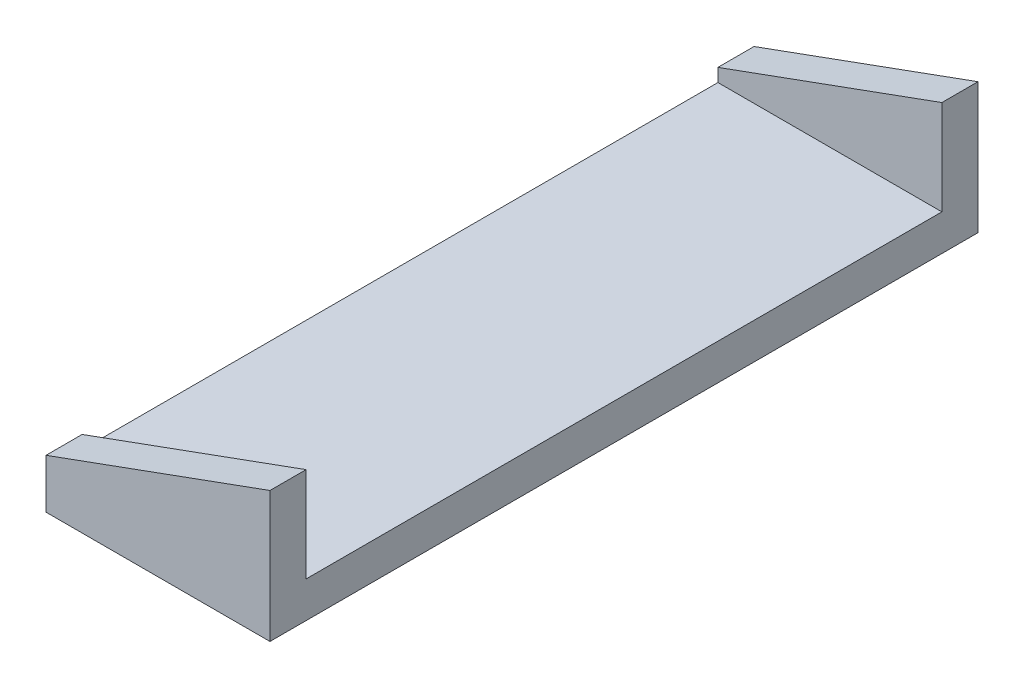
ISO-10303-21;
HEADER;
FILE_DESCRIPTION(('STEP AP214'),'2;1');
FILE_NAME('part.step','',(''),(''),'','','');
FILE_SCHEMA(('AUTOMOTIVE_DESIGN { 1 0 10303 214 1 1 1 1 }'));
ENDSEC;
DATA;
#1=APPLICATION_CONTEXT('core data for automotive mechanical design processes');
#2=APPLICATION_PROTOCOL_DEFINITION('international standard','automotive_design',2000,#1);
#3=PRODUCT_CONTEXT('',#1,'mechanical');
#4=PRODUCT('Part','Part','',(#3));
#5=PRODUCT_RELATED_PRODUCT_CATEGORY('part','',(#4));
#6=PRODUCT_DEFINITION_FORMATION('','',#4);
#7=PRODUCT_DEFINITION_CONTEXT('part definition',#1,'design');
#8=PRODUCT_DEFINITION('design','',#6,#7);
#9=PRODUCT_DEFINITION_SHAPE('','',#8);
#10=(LENGTH_UNIT() NAMED_UNIT(*) SI_UNIT(.MILLI.,.METRE.));
#11=(NAMED_UNIT(*) PLANE_ANGLE_UNIT() SI_UNIT($,.RADIAN.));
#12=(NAMED_UNIT(*) SI_UNIT($,.STERADIAN.) SOLID_ANGLE_UNIT());
#13=UNCERTAINTY_MEASURE_WITH_UNIT(LENGTH_MEASURE(1.E-05),#10,'distance_accuracy_value','');
#14=(GEOMETRIC_REPRESENTATION_CONTEXT(3) GLOBAL_UNCERTAINTY_ASSIGNED_CONTEXT((#13)) GLOBAL_UNIT_ASSIGNED_CONTEXT((#10,
#11,#12)) REPRESENTATION_CONTEXT('',''));
#15=CARTESIAN_POINT('',(0.,0.,0.));
#16=DIRECTION('',(0.,0.,1.));
#17=DIRECTION('',(1.,0.,0.));
#18=AXIS2_PLACEMENT_3D('',#15,#16,#17);
#19=CARTESIAN_POINT('',(0.,63.5,0.));
#20=DIRECTION('',(0.,0.,-1.));
#21=DIRECTION('',(-1.,0.,0.));
#22=AXIS2_PLACEMENT_3D('',#19,#20,#21);
#23=PLANE('',#22);
#24=DIRECTION('',(0.939692620785908,0.34202014332567,0.));
#25=VECTOR('',#24,1.);
#26=CARTESIAN_POINT('',(0.,63.5,0.));
#27=LINE('',#26,#25);
#28=CARTESIAN_POINT('',(63.5,86.6121098759039,0.));
#29=VERTEX_POINT('',#28);
#30=CARTESIAN_POINT('',(457.2,229.907191106508,0.));
#31=VERTEX_POINT('',#30);
#32=EDGE_CURVE('E134',#29,#31,#27,.T.);
#33=ORIENTED_EDGE('',*,*,#32,.F.);
#34=DIRECTION('',(0.,-1.,0.));
#35=VECTOR('',#34,1.);
#36=CARTESIAN_POINT('',(63.5,253.746,0.));
#37=LINE('',#36,#35);
#38=CARTESIAN_POINT('',(63.5,0.,0.));
#39=VERTEX_POINT('',#38);
#40=EDGE_CURVE('E46',#29,#39,#37,.T.);
#41=ORIENTED_EDGE('',*,*,#40,.T.);
#42=DIRECTION('',(1.,0.,0.));
#43=VECTOR('',#42,1.);
#44=CARTESIAN_POINT('',(0.,0.,0.));
#45=LINE('',#44,#43);
#46=CARTESIAN_POINT('',(457.2,0.,0.));
#47=VERTEX_POINT('',#46);
#48=EDGE_CURVE('E111',#39,#47,#45,.T.);
#49=ORIENTED_EDGE('',*,*,#48,.T.);
#50=DIRECTION('',(0.,-1.,0.));
#51=VECTOR('',#50,1.);
#52=CARTESIAN_POINT('',(457.2,63.5,0.));
#53=LINE('',#52,#51);
#54=EDGE_CURVE('E40',#31,#47,#53,.T.);
#55=ORIENTED_EDGE('',*,*,#54,.F.);
#56=EDGE_LOOP('',(#33,#41,#49,#55));
#57=FACE_BOUND('',#56,.T.);
#58=ADVANCED_FACE('F33',(#57),#23,.F.);
#59=CARTESIAN_POINT('',(457.2,63.5,0.));
#60=DIRECTION('',(-1.,0.,0.));
#61=DIRECTION('',(0.,0.,1.));
#62=AXIS2_PLACEMENT_3D('',#59,#60,#61);
#63=PLANE('',#62);
#64=DIRECTION('',(0.,0.,-1.));
#65=VECTOR('',#64,1.);
#66=CARTESIAN_POINT('',(457.2,229.907191106508,36.5759999999998));
#67=LINE('',#66,#65);
#68=CARTESIAN_POINT('',(457.2,229.907191106508,-63.5000000000001));
#69=VERTEX_POINT('',#68);
#70=EDGE_CURVE('E131',#31,#69,#67,.T.);
#71=ORIENTED_EDGE('',*,*,#70,.F.);
#72=ORIENTED_EDGE('',*,*,#54,.T.);
#73=DIRECTION('',(0.,0.,-1.));
#74=VECTOR('',#73,1.);
#75=CARTESIAN_POINT('',(457.2,0.,0.));
#76=LINE('',#75,#74);
#77=CARTESIAN_POINT('',(457.2,0.,-1244.6));
#78=VERTEX_POINT('',#77);
#79=EDGE_CURVE('E118',#47,#78,#76,.T.);
#80=ORIENTED_EDGE('',*,*,#79,.T.);
#81=DIRECTION('',(0.,-1.,0.));
#82=VECTOR('',#81,1.);
#83=CARTESIAN_POINT('',(457.2,63.5,-1244.6));
#84=LINE('',#83,#82);
#85=CARTESIAN_POINT('',(457.2,229.907191106508,-1244.6));
#86=VERTEX_POINT('',#85);
#87=EDGE_CURVE('E115',#86,#78,#84,.T.);
#88=ORIENTED_EDGE('',*,*,#87,.F.);
#89=DIRECTION('',(0.,0.,1.));
#90=VECTOR('',#89,1.);
#91=CARTESIAN_POINT('',(457.2,229.907191106508,-1281.176));
#92=LINE('',#91,#90);
#93=CARTESIAN_POINT('',(457.2,229.907191106508,-1181.1));
#94=VERTEX_POINT('',#93);
#95=EDGE_CURVE('E148',#86,#94,#92,.T.);
#96=ORIENTED_EDGE('',*,*,#95,.T.);
#97=DIRECTION('',(0.,-1.,0.));
#98=VECTOR('',#97,1.);
#99=CARTESIAN_POINT('',(457.2,330.2,-1181.1));
#100=LINE('',#99,#98);
#101=CARTESIAN_POINT('',(457.2,63.5,-1181.1));
#102=VERTEX_POINT('',#101);
#103=EDGE_CURVE('E135',#94,#102,#100,.T.);
#104=ORIENTED_EDGE('',*,*,#103,.T.);
#105=DIRECTION('',(0.,0.,-1.));
#106=VECTOR('',#105,1.);
#107=CARTESIAN_POINT('',(457.2,63.5,0.));
#108=LINE('',#107,#106);
#109=CARTESIAN_POINT('',(457.2,63.5,-63.5000000000001));
#110=VERTEX_POINT('',#109);
#111=EDGE_CURVE('E117',#110,#102,#108,.T.);
#112=ORIENTED_EDGE('',*,*,#111,.F.);
#113=DIRECTION('',(0.,-1.,0.));
#114=VECTOR('',#113,1.);
#115=CARTESIAN_POINT('',(457.2,330.2,-63.5000000000001));
#116=LINE('',#115,#114);
#117=EDGE_CURVE('E141',#69,#110,#116,.T.);
#118=ORIENTED_EDGE('',*,*,#117,.F.);
#119=EDGE_LOOP('',(#71,#72,#80,#88,#96,#104,#112,#118));
#120=FACE_BOUND('',#119,.T.);
#121=ADVANCED_FACE('F129',(#120),#63,.F.);
#122=CARTESIAN_POINT('',(457.2,330.2,-63.5000000000001));
#123=DIRECTION('',(0.,0.,1.));
#124=DIRECTION('',(1.,0.,0.));
#125=AXIS2_PLACEMENT_3D('',#122,#123,#124);
#126=PLANE('',#125);
#127=DIRECTION('',(-1.,0.,0.));
#128=VECTOR('',#127,1.);
#129=CARTESIAN_POINT('',(457.2,63.5,-63.5000000000001));
#130=LINE('',#129,#128);
#131=CARTESIAN_POINT('',(63.5,63.5,-63.5000000000001));
#132=VERTEX_POINT('',#131);
#133=EDGE_CURVE('E143',#110,#132,#130,.T.);
#134=ORIENTED_EDGE('',*,*,#133,.T.);
#135=DIRECTION('',(0.,1.,0.));
#136=VECTOR('',#135,1.);
#137=CARTESIAN_POINT('',(63.5,330.2,-63.5000000000001));
#138=LINE('',#137,#136);
#139=CARTESIAN_POINT('',(63.5,86.6121098759039,-63.5000000000001));
#140=VERTEX_POINT('',#139);
#141=EDGE_CURVE('E162',#132,#140,#138,.T.);
#142=ORIENTED_EDGE('',*,*,#141,.T.);
#143=DIRECTION('',(0.939692620785908,0.34202014332567,0.));
#144=VECTOR('',#143,1.);
#145=CARTESIAN_POINT('',(457.2,229.907191106508,-63.5000000000001));
#146=LINE('',#145,#144);
#147=EDGE_CURVE('E54',#140,#69,#146,.T.);
#148=ORIENTED_EDGE('',*,*,#147,.T.);
#149=ORIENTED_EDGE('',*,*,#117,.T.);
#150=EDGE_LOOP('',(#134,#142,#148,#149));
#151=FACE_BOUND('',#150,.T.);
#152=ADVANCED_FACE('F164',(#151),#126,.F.);
#153=CARTESIAN_POINT('',(0.,63.5,0.));
#154=DIRECTION('',(0.,-1.,0.));
#155=DIRECTION('',(0.,0.,-1.));
#156=AXIS2_PLACEMENT_3D('',#153,#154,#155);
#157=PLANE('',#156);
#158=DIRECTION('',(-1.,0.,0.));
#159=VECTOR('',#158,1.);
#160=CARTESIAN_POINT('',(457.2,63.5,-1181.1));
#161=LINE('',#160,#159);
#162=CARTESIAN_POINT('',(63.5000000000001,63.5,-1181.1));
#163=VERTEX_POINT('',#162);
#164=EDGE_CURVE('E136',#102,#163,#161,.T.);
#165=ORIENTED_EDGE('',*,*,#164,.T.);
#166=DIRECTION('',(0.,0.,1.));
#167=VECTOR('',#166,1.);
#168=CARTESIAN_POINT('',(63.5,63.5,0.));
#169=LINE('',#168,#167);
#170=EDGE_CURVE('E159',#163,#132,#169,.T.);
#171=ORIENTED_EDGE('',*,*,#170,.T.);
#172=ORIENTED_EDGE('',*,*,#133,.F.);
#173=ORIENTED_EDGE('',*,*,#111,.T.);
#174=EDGE_LOOP('',(#165,#171,#172,#173));
#175=FACE_BOUND('',#174,.T.);
#176=ADVANCED_FACE('F172',(#175),#157,.F.);
#177=CARTESIAN_POINT('',(0.,63.5,-1244.6));
#178=DIRECTION('',(0.,0.,1.));
#179=DIRECTION('',(1.,0.,0.));
#180=AXIS2_PLACEMENT_3D('',#177,#178,#179);
#181=PLANE('',#180);
#182=DIRECTION('',(-1.,0.,0.));
#183=VECTOR('',#182,1.);
#184=CARTESIAN_POINT('',(0.,0.,-1244.6));
#185=LINE('',#184,#183);
#186=CARTESIAN_POINT('',(63.5000000000002,0.,-1244.6));
#187=VERTEX_POINT('',#186);
#188=EDGE_CURVE('E110',#78,#187,#185,.T.);
#189=ORIENTED_EDGE('',*,*,#188,.T.);
#190=DIRECTION('',(0.,-1.,0.));
#191=VECTOR('',#190,1.);
#192=CARTESIAN_POINT('',(63.5000000000002,253.746,-1244.6));
#193=LINE('',#192,#191);
#194=CARTESIAN_POINT('',(63.5000000000002,86.612109875904,-1244.6));
#195=VERTEX_POINT('',#194);
#196=EDGE_CURVE('E95',#195,#187,#193,.T.);
#197=ORIENTED_EDGE('',*,*,#196,.F.);
#198=DIRECTION('',(0.939692620785908,0.34202014332567,0.));
#199=VECTOR('',#198,1.);
#200=CARTESIAN_POINT('',(0.,63.5,-1244.6));
#201=LINE('',#200,#199);
#202=EDGE_CURVE('E146',#195,#86,#201,.T.);
#203=ORIENTED_EDGE('',*,*,#202,.T.);
#204=ORIENTED_EDGE('',*,*,#87,.T.);
#205=EDGE_LOOP('',(#189,#197,#203,#204));
#206=FACE_BOUND('',#205,.T.);
#207=ADVANCED_FACE('F113',(#206),#181,.F.);
#208=CARTESIAN_POINT('',(0.,0.,0.));
#209=DIRECTION('',(0.,-1.,0.));
#210=DIRECTION('',(0.,0.,-1.));
#211=AXIS2_PLACEMENT_3D('',#208,#209,#210);
#212=PLANE('',#211);
#213=DIRECTION('',(0.,0.,1.));
#214=VECTOR('',#213,1.);
#215=CARTESIAN_POINT('',(63.5,0.,0.));
#216=LINE('',#215,#214);
#217=EDGE_CURVE('E98',#187,#39,#216,.T.);
#218=ORIENTED_EDGE('',*,*,#217,.F.);
#219=ORIENTED_EDGE('',*,*,#188,.F.);
#220=ORIENTED_EDGE('',*,*,#79,.F.);
#221=ORIENTED_EDGE('',*,*,#48,.F.);
#222=EDGE_LOOP('',(#218,#219,#220,#221));
#223=FACE_BOUND('',#222,.T.);
#224=ADVANCED_FACE('F108',(#223),#212,.T.);
#225=CARTESIAN_POINT('',(457.2,330.2,-1181.1));
#226=DIRECTION('',(0.,0.,1.));
#227=DIRECTION('',(1.,0.,0.));
#228=AXIS2_PLACEMENT_3D('',#225,#226,#227);
#229=PLANE('',#228);
#230=DIRECTION('',(0.,1.,0.));
#231=VECTOR('',#230,1.);
#232=CARTESIAN_POINT('',(63.5000000000002,330.2,-1181.1));
#233=LINE('',#232,#231);
#234=CARTESIAN_POINT('',(63.5000000000002,86.612109875904,-1181.1));
#235=VERTEX_POINT('',#234);
#236=EDGE_CURVE('E157',#163,#235,#233,.T.);
#237=ORIENTED_EDGE('',*,*,#236,.F.);
#238=ORIENTED_EDGE('',*,*,#164,.F.);
#239=ORIENTED_EDGE('',*,*,#103,.F.);
#240=DIRECTION('',(0.939692620785908,0.34202014332567,0.));
#241=VECTOR('',#240,1.);
#242=CARTESIAN_POINT('',(457.2,229.907191106508,-1181.1));
#243=LINE('',#242,#241);
#244=EDGE_CURVE('E151',#235,#94,#243,.T.);
#245=ORIENTED_EDGE('',*,*,#244,.F.);
#246=EDGE_LOOP('',(#237,#238,#239,#245));
#247=FACE_BOUND('',#246,.T.);
#248=ADVANCED_FACE('F176',(#247),#229,.T.);
#249=CARTESIAN_POINT('',(457.2,229.907191106508,-1281.176));
#250=DIRECTION('',(0.34202014332567,-0.939692620785908,0.));
#251=DIRECTION('',(0.939692620785908,0.34202014332567,0.));
#252=AXIS2_PLACEMENT_3D('',#249,#250,#251);
#253=PLANE('',#252);
#254=ORIENTED_EDGE('',*,*,#202,.F.);
#255=DIRECTION('',(0.,0.,1.));
#256=VECTOR('',#255,1.);
#257=CARTESIAN_POINT('',(63.5000000000002,86.612109875904,-1281.176));
#258=LINE('',#257,#256);
#259=EDGE_CURVE('E100',#195,#235,#258,.T.);
#260=ORIENTED_EDGE('',*,*,#259,.T.);
#261=ORIENTED_EDGE('',*,*,#244,.T.);
#262=ORIENTED_EDGE('',*,*,#95,.F.);
#263=EDGE_LOOP('',(#254,#260,#261,#262));
#264=FACE_BOUND('',#263,.T.);
#265=ADVANCED_FACE('F179',(#264),#253,.F.);
#266=CARTESIAN_POINT('',(457.2,229.907191106508,36.5759999999998));
#267=DIRECTION('',(-0.34202014332567,0.939692620785908,0.));
#268=DIRECTION('',(-0.939692620785908,-0.34202014332567,0.));
#269=AXIS2_PLACEMENT_3D('',#266,#267,#268);
#270=PLANE('',#269);
#271=DIRECTION('',(0.,0.,-1.));
#272=VECTOR('',#271,1.);
#273=CARTESIAN_POINT('',(63.5,86.6121098759039,36.5759999999998));
#274=LINE('',#273,#272);
#275=EDGE_CURVE('E11',#29,#140,#274,.T.);
#276=ORIENTED_EDGE('',*,*,#275,.F.);
#277=ORIENTED_EDGE('',*,*,#32,.T.);
#278=ORIENTED_EDGE('',*,*,#70,.T.);
#279=ORIENTED_EDGE('',*,*,#147,.F.);
#280=EDGE_LOOP('',(#276,#277,#278,#279));
#281=FACE_BOUND('',#280,.T.);
#282=ADVANCED_FACE('F167',(#281),#270,.T.);
#283=CARTESIAN_POINT('',(63.5,253.746,0.));
#284=DIRECTION('',(1.,0.,0.));
#285=DIRECTION('',(0.,0.,-1.));
#286=AXIS2_PLACEMENT_3D('',#283,#284,#285);
#287=PLANE('',#286);
#288=ORIENTED_EDGE('',*,*,#196,.T.);
#289=ORIENTED_EDGE('',*,*,#217,.T.);
#290=ORIENTED_EDGE('',*,*,#40,.F.);
#291=ORIENTED_EDGE('',*,*,#275,.T.);
#292=ORIENTED_EDGE('',*,*,#141,.F.);
#293=ORIENTED_EDGE('',*,*,#170,.F.);
#294=ORIENTED_EDGE('',*,*,#236,.T.);
#295=ORIENTED_EDGE('',*,*,#259,.F.);
#296=EDGE_LOOP('',(#288,#289,#290,#291,#292,#293,#294,#295));
#297=FACE_BOUND('',#296,.T.);
#298=ADVANCED_FACE('F97',(#297),#287,.F.);
#299=CLOSED_SHELL('',(#58,#121,#152,#176,#207,#224,#248,#265,#282,#298));
#300=MANIFOLD_SOLID_BREP('B2',#299);
#301=ADVANCED_BREP_SHAPE_REPRESENTATION('',(#18,#300),#14);
#302=SHAPE_DEFINITION_REPRESENTATION(#9,#301);
ENDSEC;
END-ISO-10303-21;
